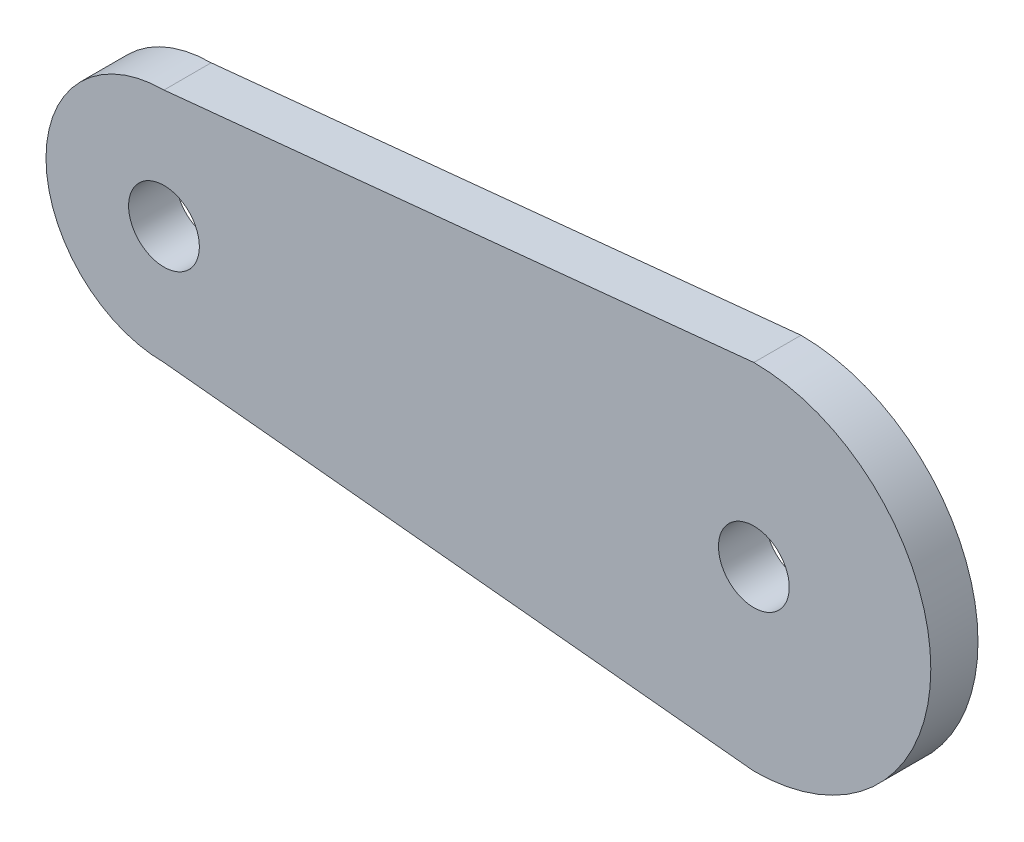
ISO-10303-21;
HEADER;
FILE_DESCRIPTION(('STEP AP214'),'2;1');
FILE_NAME('part.step','',(''),(''),'','','');
FILE_SCHEMA(('AUTOMOTIVE_DESIGN { 1 0 10303 214 1 1 1 1 }'));
ENDSEC;
DATA;
#1=APPLICATION_CONTEXT('core data for automotive mechanical design processes');
#2=APPLICATION_PROTOCOL_DEFINITION('international standard','automotive_design',2000,#1);
#3=PRODUCT_CONTEXT('',#1,'mechanical');
#4=PRODUCT('Part','Part','',(#3));
#5=PRODUCT_RELATED_PRODUCT_CATEGORY('part','',(#4));
#6=PRODUCT_DEFINITION_FORMATION('','',#4);
#7=PRODUCT_DEFINITION_CONTEXT('part definition',#1,'design');
#8=PRODUCT_DEFINITION('design','',#6,#7);
#9=PRODUCT_DEFINITION_SHAPE('','',#8);
#10=(LENGTH_UNIT() NAMED_UNIT(*) SI_UNIT(.MILLI.,.METRE.));
#11=(NAMED_UNIT(*) PLANE_ANGLE_UNIT() SI_UNIT($,.RADIAN.));
#12=(NAMED_UNIT(*) SI_UNIT($,.STERADIAN.) SOLID_ANGLE_UNIT());
#13=UNCERTAINTY_MEASURE_WITH_UNIT(LENGTH_MEASURE(1.E-05),#10,'distance_accuracy_value','');
#14=(GEOMETRIC_REPRESENTATION_CONTEXT(3) GLOBAL_UNCERTAINTY_ASSIGNED_CONTEXT((#13)) GLOBAL_UNIT_ASSIGNED_CONTEXT((#10,
#11,#12)) REPRESENTATION_CONTEXT('',''));
#15=CARTESIAN_POINT('',(0.,0.,0.));
#16=DIRECTION('',(0.,0.,1.));
#17=DIRECTION('',(1.,0.,0.));
#18=AXIS2_PLACEMENT_3D('',#15,#16,#17);
#19=CARTESIAN_POINT('',(0.,-5.,2.));
#20=DIRECTION('',(0.,0.,-1.));
#21=DIRECTION('',(-1.,0.,0.));
#22=AXIS2_PLACEMENT_3D('',#19,#20,#21);
#23=CYLINDRICAL_SURFACE('',#22,5.);
#24=CARTESIAN_POINT('',(0.,-5.,0.));
#25=DIRECTION('',(0.,0.,1.));
#26=DIRECTION('',(1.,0.,0.));
#27=AXIS2_PLACEMENT_3D('',#24,#25,#26);
#28=CIRCLE('',#27,5.);
#29=CARTESIAN_POINT('',(0.,0.,0.));
#30=VERTEX_POINT('',#29);
#31=CARTESIAN_POINT('',(0.,-10.,0.));
#32=VERTEX_POINT('',#31);
#33=EDGE_CURVE('E107',#30,#32,#28,.T.);
#34=ORIENTED_EDGE('',*,*,#33,.T.);
#35=DIRECTION('',(0.,0.,-1.));
#36=VECTOR('',#35,1.);
#37=CARTESIAN_POINT('',(0.,-10.,2.));
#38=LINE('',#37,#36);
#39=CARTESIAN_POINT('',(0.,-10.,2.));
#40=VERTEX_POINT('',#39);
#41=EDGE_CURVE('E11',#40,#32,#38,.T.);
#42=ORIENTED_EDGE('',*,*,#41,.F.);
#43=CARTESIAN_POINT('',(0.,-5.,2.));
#44=DIRECTION('',(0.,0.,1.));
#45=DIRECTION('',(1.,0.,0.));
#46=AXIS2_PLACEMENT_3D('',#43,#44,#45);
#47=CIRCLE('',#46,5.);
#48=CARTESIAN_POINT('',(0.,0.,2.));
#49=VERTEX_POINT('',#48);
#50=EDGE_CURVE('E87',#49,#40,#47,.T.);
#51=ORIENTED_EDGE('',*,*,#50,.F.);
#52=DIRECTION('',(0.,0.,-1.));
#53=VECTOR('',#52,1.);
#54=CARTESIAN_POINT('',(0.,0.,2.));
#55=LINE('',#54,#53);
#56=EDGE_CURVE('E53',#49,#30,#55,.T.);
#57=ORIENTED_EDGE('',*,*,#56,.T.);
#58=EDGE_LOOP('',(#34,#42,#51,#57));
#59=FACE_BOUND('',#58,.T.);
#60=ADVANCED_FACE('F37',(#59),#23,.T.);
#61=CARTESIAN_POINT('',(-0.990099009900988,-9.9009900990099,2.));
#62=DIRECTION('',(0.0995037190209987,0.995037190209989,0.));
#63=DIRECTION('',(-0.995037190209989,0.0995037190209987,0.));
#64=AXIS2_PLACEMENT_3D('',#61,#62,#63);
#65=PLANE('',#64);
#66=DIRECTION('',(0.995037190209989,-0.0995037190209987,0.));
#67=VECTOR('',#66,1.);
#68=CARTESIAN_POINT('',(-0.990099009900988,-9.9009900990099,0.));
#69=LINE('',#68,#67);
#70=CARTESIAN_POINT('',(25.,-12.5,0.));
#71=VERTEX_POINT('',#70);
#72=EDGE_CURVE('E92',#32,#71,#69,.T.);
#73=ORIENTED_EDGE('',*,*,#72,.T.);
#74=DIRECTION('',(0.,0.,-1.));
#75=VECTOR('',#74,1.);
#76=CARTESIAN_POINT('',(25.,-12.5,2.));
#77=LINE('',#76,#75);
#78=CARTESIAN_POINT('',(25.,-12.5,2.));
#79=VERTEX_POINT('',#78);
#80=EDGE_CURVE('E45',#79,#71,#77,.T.);
#81=ORIENTED_EDGE('',*,*,#80,.F.);
#82=DIRECTION('',(0.995037190209989,-0.0995037190209987,0.));
#83=VECTOR('',#82,1.);
#84=CARTESIAN_POINT('',(-0.990099009900988,-9.9009900990099,2.));
#85=LINE('',#84,#83);
#86=EDGE_CURVE('E78',#40,#79,#85,.T.);
#87=ORIENTED_EDGE('',*,*,#86,.F.);
#88=ORIENTED_EDGE('',*,*,#41,.T.);
#89=EDGE_LOOP('',(#73,#81,#87,#88));
#90=FACE_BOUND('',#89,.T.);
#91=ADVANCED_FACE('F91',(#90),#65,.F.);
#92=CARTESIAN_POINT('',(25.,-4.99999999999999,2.));
#93=DIRECTION('',(0.,0.,-1.));
#94=DIRECTION('',(-1.,0.,0.));
#95=AXIS2_PLACEMENT_3D('',#92,#93,#94);
#96=CYLINDRICAL_SURFACE('',#95,7.5);
#97=CARTESIAN_POINT('',(25.,-4.99999999999999,0.));
#98=DIRECTION('',(0.,0.,1.));
#99=DIRECTION('',(1.,0.,0.));
#100=AXIS2_PLACEMENT_3D('',#97,#98,#99);
#101=CIRCLE('',#100,7.5);
#102=CARTESIAN_POINT('',(25.,2.50000000000001,0.));
#103=VERTEX_POINT('',#102);
#104=EDGE_CURVE('E110',#103,#71,#101,.F.);
#105=ORIENTED_EDGE('',*,*,#104,.F.);
#106=DIRECTION('',(0.,0.,-1.));
#107=VECTOR('',#106,1.);
#108=CARTESIAN_POINT('',(25.,2.50000000000001,2.));
#109=LINE('',#108,#107);
#110=CARTESIAN_POINT('',(25.,2.50000000000001,2.));
#111=VERTEX_POINT('',#110);
#112=EDGE_CURVE('E67',#111,#103,#109,.T.);
#113=ORIENTED_EDGE('',*,*,#112,.F.);
#114=CARTESIAN_POINT('',(25.,-4.99999999999999,2.));
#115=DIRECTION('',(0.,0.,1.));
#116=DIRECTION('',(1.,0.,0.));
#117=AXIS2_PLACEMENT_3D('',#114,#115,#116);
#118=CIRCLE('',#117,7.5);
#119=EDGE_CURVE('E86',#111,#79,#118,.F.);
#120=ORIENTED_EDGE('',*,*,#119,.T.);
#121=ORIENTED_EDGE('',*,*,#80,.T.);
#122=EDGE_LOOP('',(#105,#113,#120,#121));
#123=FACE_BOUND('',#122,.T.);
#124=ADVANCED_FACE('F95',(#123),#96,.T.);
#125=CARTESIAN_POINT('',(0.,-5.,2.));
#126=DIRECTION('',(0.,0.,-1.));
#127=DIRECTION('',(-1.,0.,0.));
#128=AXIS2_PLACEMENT_3D('',#125,#126,#127);
#129=CYLINDRICAL_SURFACE('',#128,1.5);
#130=CARTESIAN_POINT('',(0.,-5.,2.));
#131=DIRECTION('',(0.,0.,1.));
#132=DIRECTION('',(1.,0.,0.));
#133=AXIS2_PLACEMENT_3D('',#130,#131,#132);
#134=CIRCLE('',#133,1.5);
#135=CARTESIAN_POINT('',(1.5,-5.,2.));
#136=VERTEX_POINT('',#135);
#137=EDGE_CURVE('E98',#136,#136,#134,.T.);
#138=ORIENTED_EDGE('',*,*,#137,.T.);
#139=EDGE_LOOP('',(#138));
#140=FACE_BOUND('',#139,.T.);
#141=CARTESIAN_POINT('',(0.,-5.,0.));
#142=DIRECTION('',(0.,0.,1.));
#143=DIRECTION('',(1.,0.,0.));
#144=AXIS2_PLACEMENT_3D('',#141,#142,#143);
#145=CIRCLE('',#144,1.5);
#146=CARTESIAN_POINT('',(1.5,-5.,0.));
#147=VERTEX_POINT('',#146);
#148=EDGE_CURVE('E115',#147,#147,#145,.T.);
#149=ORIENTED_EDGE('',*,*,#148,.F.);
#150=EDGE_LOOP('',(#149));
#151=FACE_BOUND('',#150,.T.);
#152=ADVANCED_FACE('F136',(#140,#151),#129,.F.);
#153=CARTESIAN_POINT('',(0.,0.,2.));
#154=DIRECTION('',(-0.0995037190209991,0.995037190209989,0.));
#155=DIRECTION('',(-0.995037190209989,-0.0995037190209992,0.));
#156=AXIS2_PLACEMENT_3D('',#153,#154,#155);
#157=PLANE('',#156);
#158=DIRECTION('',(0.995037190209989,0.0995037190209992,0.));
#159=VECTOR('',#158,1.);
#160=CARTESIAN_POINT('',(0.,0.,0.));
#161=LINE('',#160,#159);
#162=EDGE_CURVE('E112',#30,#103,#161,.T.);
#163=ORIENTED_EDGE('',*,*,#162,.F.);
#164=ORIENTED_EDGE('',*,*,#56,.F.);
#165=DIRECTION('',(0.995037190209989,0.0995037190209992,0.));
#166=VECTOR('',#165,1.);
#167=CARTESIAN_POINT('',(0.,0.,2.));
#168=LINE('',#167,#166);
#169=EDGE_CURVE('E96',#49,#111,#168,.T.);
#170=ORIENTED_EDGE('',*,*,#169,.T.);
#171=ORIENTED_EDGE('',*,*,#112,.T.);
#172=EDGE_LOOP('',(#163,#164,#170,#171));
#173=FACE_BOUND('',#172,.T.);
#174=ADVANCED_FACE('F128',(#173),#157,.T.);
#175=CARTESIAN_POINT('',(25.,-4.99999999999999,2.));
#176=DIRECTION('',(0.,0.,-1.));
#177=DIRECTION('',(-1.,0.,0.));
#178=AXIS2_PLACEMENT_3D('',#175,#176,#177);
#179=CYLINDRICAL_SURFACE('',#178,1.5);
#180=CARTESIAN_POINT('',(25.,-4.99999999999999,2.));
#181=DIRECTION('',(0.,0.,1.));
#182=DIRECTION('',(1.,0.,0.));
#183=AXIS2_PLACEMENT_3D('',#180,#181,#182);
#184=CIRCLE('',#183,1.5);
#185=CARTESIAN_POINT('',(26.5,-4.99999999999999,2.));
#186=VERTEX_POINT('',#185);
#187=EDGE_CURVE('E104',#186,#186,#184,.T.);
#188=ORIENTED_EDGE('',*,*,#187,.T.);
#189=EDGE_LOOP('',(#188));
#190=FACE_BOUND('',#189,.T.);
#191=CARTESIAN_POINT('',(25.,-4.99999999999999,0.));
#192=DIRECTION('',(0.,0.,1.));
#193=DIRECTION('',(1.,0.,0.));
#194=AXIS2_PLACEMENT_3D('',#191,#192,#193);
#195=CIRCLE('',#194,1.5);
#196=CARTESIAN_POINT('',(26.5,-4.99999999999999,0.));
#197=VERTEX_POINT('',#196);
#198=EDGE_CURVE('E118',#197,#197,#195,.T.);
#199=ORIENTED_EDGE('',*,*,#198,.F.);
#200=EDGE_LOOP('',(#199));
#201=FACE_BOUND('',#200,.T.);
#202=ADVANCED_FACE('F126',(#190,#201),#179,.F.);
#203=CARTESIAN_POINT('',(0.,0.,2.));
#204=DIRECTION('',(0.,0.,1.));
#205=DIRECTION('',(1.,0.,0.));
#206=AXIS2_PLACEMENT_3D('',#203,#204,#205);
#207=PLANE('',#206);
#208=ORIENTED_EDGE('',*,*,#50,.T.);
#209=ORIENTED_EDGE('',*,*,#86,.T.);
#210=ORIENTED_EDGE('',*,*,#119,.F.);
#211=ORIENTED_EDGE('',*,*,#169,.F.);
#212=EDGE_LOOP('',(#208,#209,#210,#211));
#213=FACE_BOUND('',#212,.T.);
#214=ORIENTED_EDGE('',*,*,#137,.F.);
#215=EDGE_LOOP('',(#214));
#216=FACE_BOUND('',#215,.T.);
#217=ORIENTED_EDGE('',*,*,#187,.F.);
#218=EDGE_LOOP('',(#217));
#219=FACE_BOUND('',#218,.T.);
#220=ADVANCED_FACE('F82',(#213,#216,#219),#207,.T.);
#221=CARTESIAN_POINT('',(0.,0.,0.));
#222=DIRECTION('',(0.,0.,1.));
#223=DIRECTION('',(1.,0.,0.));
#224=AXIS2_PLACEMENT_3D('',#221,#222,#223);
#225=PLANE('',#224);
#226=ORIENTED_EDGE('',*,*,#33,.F.);
#227=ORIENTED_EDGE('',*,*,#162,.T.);
#228=ORIENTED_EDGE('',*,*,#104,.T.);
#229=ORIENTED_EDGE('',*,*,#72,.F.);
#230=EDGE_LOOP('',(#226,#227,#228,#229));
#231=FACE_BOUND('',#230,.T.);
#232=ORIENTED_EDGE('',*,*,#148,.T.);
#233=EDGE_LOOP('',(#232));
#234=FACE_BOUND('',#233,.T.);
#235=ORIENTED_EDGE('',*,*,#198,.T.);
#236=EDGE_LOOP('',(#235));
#237=FACE_BOUND('',#236,.T.);
#238=ADVANCED_FACE('F124',(#231,#234,#237),#225,.F.);
#239=CLOSED_SHELL('',(#60,#91,#124,#152,#174,#202,#220,#238));
#240=MANIFOLD_SOLID_BREP('B2',#239);
#241=ADVANCED_BREP_SHAPE_REPRESENTATION('',(#18,#240),#14);
#242=SHAPE_DEFINITION_REPRESENTATION(#9,#241);
ENDSEC;
END-ISO-10303-21;
